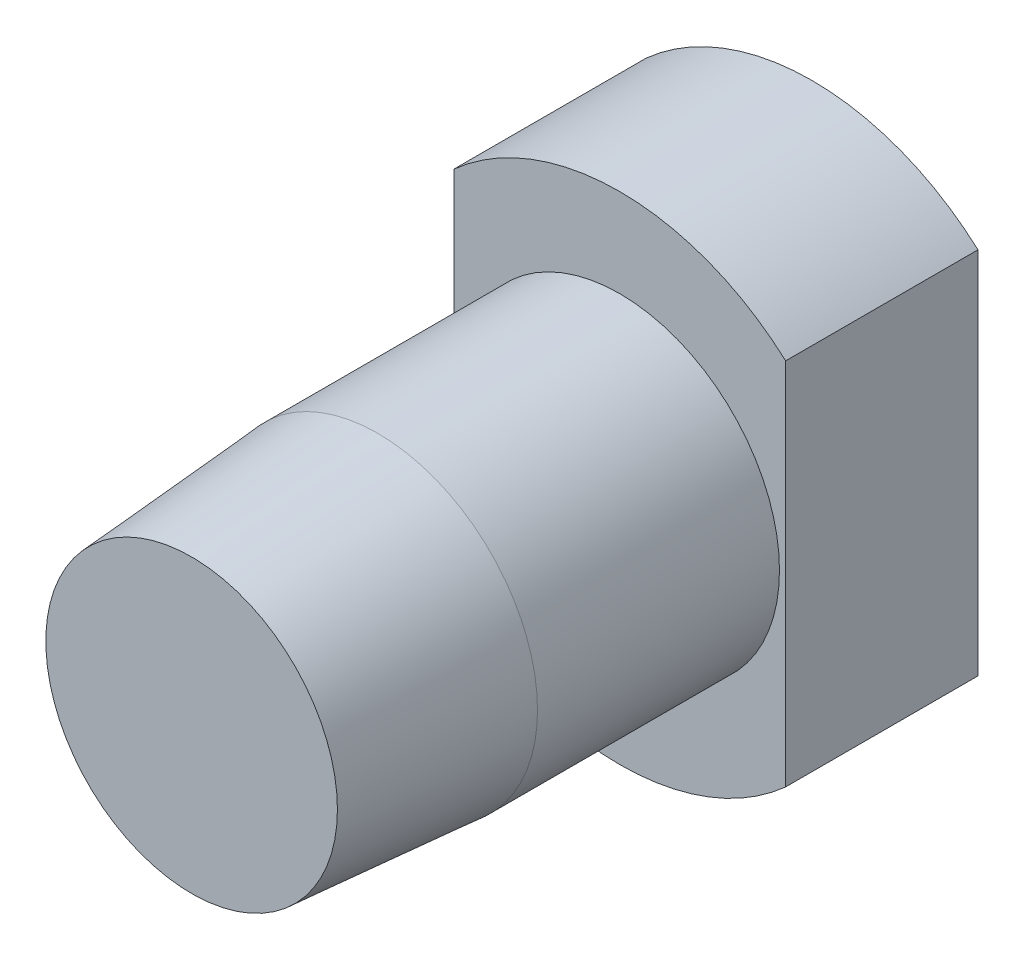
ISO-10303-21;
HEADER;
FILE_DESCRIPTION(('STEP AP214'),'2;1');
FILE_NAME('part.step','',(''),(''),'','','');
FILE_SCHEMA(('AUTOMOTIVE_DESIGN { 1 0 10303 214 1 1 1 1 }'));
ENDSEC;
DATA;
#1=APPLICATION_CONTEXT('core data for automotive mechanical design processes');
#2=APPLICATION_PROTOCOL_DEFINITION('international standard','automotive_design',2000,#1);
#3=PRODUCT_CONTEXT('',#1,'mechanical');
#4=PRODUCT('Part','Part','',(#3));
#5=PRODUCT_RELATED_PRODUCT_CATEGORY('part','',(#4));
#6=PRODUCT_DEFINITION_FORMATION('','',#4);
#7=PRODUCT_DEFINITION_CONTEXT('part definition',#1,'design');
#8=PRODUCT_DEFINITION('design','',#6,#7);
#9=PRODUCT_DEFINITION_SHAPE('','',#8);
#10=(LENGTH_UNIT() NAMED_UNIT(*) SI_UNIT(.MILLI.,.METRE.));
#11=(NAMED_UNIT(*) PLANE_ANGLE_UNIT() SI_UNIT($,.RADIAN.));
#12=(NAMED_UNIT(*) SI_UNIT($,.STERADIAN.) SOLID_ANGLE_UNIT());
#13=UNCERTAINTY_MEASURE_WITH_UNIT(LENGTH_MEASURE(1.E-05),#10,'distance_accuracy_value','');
#14=(GEOMETRIC_REPRESENTATION_CONTEXT(3) GLOBAL_UNCERTAINTY_ASSIGNED_CONTEXT((#13)) GLOBAL_UNIT_ASSIGNED_CONTEXT((#10,
#11,#12)) REPRESENTATION_CONTEXT('',''));
#15=CARTESIAN_POINT('',(0.,0.,0.));
#16=DIRECTION('',(0.,0.,1.));
#17=DIRECTION('',(1.,0.,0.));
#18=AXIS2_PLACEMENT_3D('',#15,#16,#17);
#19=CARTESIAN_POINT('',(0.,0.,0.));
#20=DIRECTION('',(0.,0.,1.));
#21=DIRECTION('',(1.,0.,0.));
#22=AXIS2_PLACEMENT_3D('',#19,#20,#21);
#23=CYLINDRICAL_SURFACE('',#22,4.);
#24=CARTESIAN_POINT('',(0.,0.,-10.));
#25=DIRECTION('',(0.,0.,1.));
#26=DIRECTION('',(1.,0.,0.));
#27=AXIS2_PLACEMENT_3D('',#24,#25,#26);
#28=CIRCLE('',#27,4.);
#29=CARTESIAN_POINT('',(-2.675,-2.97394939432398,-10.));
#30=VERTEX_POINT('',#29);
#31=CARTESIAN_POINT('',(2.675,-2.97394939432398,-10.));
#32=VERTEX_POINT('',#31);
#33=EDGE_CURVE('E97',#30,#32,#28,.T.);
#34=ORIENTED_EDGE('',*,*,#33,.T.);
#35=DIRECTION('',(0.,0.,1.));
#36=VECTOR('',#35,1.);
#37=CARTESIAN_POINT('',(2.675,-2.97394939432398,0.));
#38=LINE('',#37,#36);
#39=CARTESIAN_POINT('',(2.675,-2.97394939432398,-6.9));
#40=VERTEX_POINT('',#39);
#41=EDGE_CURVE('E56',#32,#40,#38,.T.);
#42=ORIENTED_EDGE('',*,*,#41,.T.);
#43=CARTESIAN_POINT('',(0.,0.,-6.9));
#44=DIRECTION('',(0.,0.,1.));
#45=DIRECTION('',(1.,0.,0.));
#46=AXIS2_PLACEMENT_3D('',#43,#44,#45);
#47=CIRCLE('',#46,4.);
#48=CARTESIAN_POINT('',(-2.675,-2.97394939432398,-6.9));
#49=VERTEX_POINT('',#48);
#50=EDGE_CURVE('E105',#49,#40,#47,.T.);
#51=ORIENTED_EDGE('',*,*,#50,.F.);
#52=DIRECTION('',(0.,0.,1.));
#53=VECTOR('',#52,1.);
#54=CARTESIAN_POINT('',(-2.675,-2.97394939432398,0.));
#55=LINE('',#54,#53);
#56=EDGE_CURVE('E140',#49,#30,#55,.F.);
#57=ORIENTED_EDGE('',*,*,#56,.T.);
#58=EDGE_LOOP('',(#34,#42,#51,#57));
#59=FACE_BOUND('',#58,.T.);
#60=ADVANCED_FACE('F41',(#59),#23,.T.);
#61=CARTESIAN_POINT('',(0.,0.,0.));
#62=DIRECTION('',(0.,0.,-1.));
#63=DIRECTION('',(-1.,0.,0.));
#64=AXIS2_PLACEMENT_3D('',#61,#62,#63);
#65=PLANE('',#64);
#66=CARTESIAN_POINT('',(0.,0.,0.));
#67=DIRECTION('',(0.,0.,1.));
#68=DIRECTION('',(1.,0.,0.));
#69=AXIS2_PLACEMENT_3D('',#66,#67,#68);
#70=CIRCLE('',#69,2.35);
#71=CARTESIAN_POINT('',(2.35,0.,0.));
#72=VERTEX_POINT('',#71);
#73=EDGE_CURVE('E114',#72,#72,#70,.T.);
#74=ORIENTED_EDGE('',*,*,#73,.T.);
#75=EDGE_LOOP('',(#74));
#76=FACE_BOUND('',#75,.T.);
#77=ADVANCED_FACE('F43',(#76),#65,.F.);
#78=CARTESIAN_POINT('',(0.,0.,-3.));
#79=DIRECTION('',(0.,0.,-1.));
#80=DIRECTION('',(-1.,0.,0.));
#81=AXIS2_PLACEMENT_3D('',#78,#79,#80);
#82=CONICAL_SURFACE('',#81,2.575,0.074859847710767);
#83=ORIENTED_EDGE('',*,*,#73,.F.);
#84=EDGE_LOOP('',(#83));
#85=FACE_BOUND('',#84,.T.);
#86=CARTESIAN_POINT('',(0.,0.,-3.));
#87=DIRECTION('',(0.,0.,1.));
#88=DIRECTION('',(1.,0.,0.));
#89=AXIS2_PLACEMENT_3D('',#86,#87,#88);
#90=CIRCLE('',#89,2.575);
#91=CARTESIAN_POINT('',(2.575,0.,-3.));
#92=VERTEX_POINT('',#91);
#93=EDGE_CURVE('E111',#92,#92,#90,.T.);
#94=ORIENTED_EDGE('',*,*,#93,.T.);
#95=EDGE_LOOP('',(#94));
#96=FACE_BOUND('',#95,.T.);
#97=ADVANCED_FACE('F119',(#85,#96),#82,.T.);
#98=CARTESIAN_POINT('',(0.,0.,0.));
#99=DIRECTION('',(0.,0.,1.));
#100=DIRECTION('',(1.,0.,0.));
#101=AXIS2_PLACEMENT_3D('',#98,#99,#100);
#102=CYLINDRICAL_SURFACE('',#101,2.575);
#103=ORIENTED_EDGE('',*,*,#93,.F.);
#104=EDGE_LOOP('',(#103));
#105=FACE_BOUND('',#104,.T.);
#106=CARTESIAN_POINT('',(0.,0.,-6.9));
#107=DIRECTION('',(0.,0.,1.));
#108=DIRECTION('',(1.,0.,0.));
#109=AXIS2_PLACEMENT_3D('',#106,#107,#108);
#110=CIRCLE('',#109,2.575);
#111=CARTESIAN_POINT('',(2.575,0.,-6.9));
#112=VERTEX_POINT('',#111);
#113=EDGE_CURVE('E108',#112,#112,#110,.T.);
#114=ORIENTED_EDGE('',*,*,#113,.T.);
#115=EDGE_LOOP('',(#114));
#116=FACE_BOUND('',#115,.T.);
#117=ADVANCED_FACE('F122',(#105,#116),#102,.T.);
#118=CARTESIAN_POINT('',(0.,2.575,-6.9));
#119=DIRECTION('',(0.,0.,-1.));
#120=DIRECTION('',(-1.,0.,0.));
#121=AXIS2_PLACEMENT_3D('',#118,#119,#120);
#122=PLANE('',#121);
#123=ORIENTED_EDGE('',*,*,#113,.F.);
#124=EDGE_LOOP('',(#123));
#125=FACE_BOUND('',#124,.T.);
#126=ORIENTED_EDGE('',*,*,#50,.T.);
#127=DIRECTION('',(0.,1.,0.));
#128=VECTOR('',#127,1.);
#129=CARTESIAN_POINT('',(2.675,2.575,-6.9));
#130=LINE('',#129,#128);
#131=CARTESIAN_POINT('',(2.675,2.97394939432398,-6.9));
#132=VERTEX_POINT('',#131);
#133=EDGE_CURVE('E92',#40,#132,#130,.T.);
#134=ORIENTED_EDGE('',*,*,#133,.T.);
#135=CARTESIAN_POINT('',(-2.675,2.97394939432398,-6.9));
#136=VERTEX_POINT('',#135);
#137=EDGE_CURVE('E91',#132,#136,#47,.T.);
#138=ORIENTED_EDGE('',*,*,#137,.T.);
#139=DIRECTION('',(0.,-1.,0.));
#140=VECTOR('',#139,1.);
#141=CARTESIAN_POINT('',(-2.675,2.575,-6.9));
#142=LINE('',#141,#140);
#143=EDGE_CURVE('E137',#136,#49,#142,.T.);
#144=ORIENTED_EDGE('',*,*,#143,.T.);
#145=EDGE_LOOP('',(#126,#134,#138,#144));
#146=FACE_BOUND('',#145,.T.);
#147=ADVANCED_FACE('F127',(#125,#146),#122,.F.);
#148=ORIENTED_EDGE('',*,*,#137,.F.);
#149=DIRECTION('',(0.,0.,1.));
#150=VECTOR('',#149,1.);
#151=CARTESIAN_POINT('',(2.675,2.97394939432398,0.));
#152=LINE('',#151,#150);
#153=CARTESIAN_POINT('',(2.675,2.97394939432398,-10.));
#154=VERTEX_POINT('',#153);
#155=EDGE_CURVE('E84',#132,#154,#152,.F.);
#156=ORIENTED_EDGE('',*,*,#155,.T.);
#157=CARTESIAN_POINT('',(-2.675,2.97394939432398,-10.));
#158=VERTEX_POINT('',#157);
#159=EDGE_CURVE('E63',#154,#158,#28,.T.);
#160=ORIENTED_EDGE('',*,*,#159,.T.);
#161=DIRECTION('',(0.,0.,1.));
#162=VECTOR('',#161,1.);
#163=CARTESIAN_POINT('',(-2.675,2.97394939432398,0.));
#164=LINE('',#163,#162);
#165=EDGE_CURVE('E101',#158,#136,#164,.T.);
#166=ORIENTED_EDGE('',*,*,#165,.T.);
#167=EDGE_LOOP('',(#148,#156,#160,#166));
#168=FACE_BOUND('',#167,.T.);
#169=ADVANCED_FACE('F90',(#168),#23,.T.);
#170=CARTESIAN_POINT('',(0.,4.,-10.));
#171=DIRECTION('',(0.,0.,1.));
#172=DIRECTION('',(1.,0.,0.));
#173=AXIS2_PLACEMENT_3D('',#170,#171,#172);
#174=PLANE('',#173);
#175=ORIENTED_EDGE('',*,*,#159,.F.);
#176=DIRECTION('',(0.,-1.,0.));
#177=VECTOR('',#176,1.);
#178=CARTESIAN_POINT('',(2.675,4.,-10.));
#179=LINE('',#178,#177);
#180=EDGE_CURVE('E11',#154,#32,#179,.T.);
#181=ORIENTED_EDGE('',*,*,#180,.T.);
#182=ORIENTED_EDGE('',*,*,#33,.F.);
#183=DIRECTION('',(0.,1.,0.));
#184=VECTOR('',#183,1.);
#185=CARTESIAN_POINT('',(-2.675,4.,-10.));
#186=LINE('',#185,#184);
#187=EDGE_CURVE('E49',#30,#158,#186,.T.);
#188=ORIENTED_EDGE('',*,*,#187,.T.);
#189=EDGE_LOOP('',(#175,#181,#182,#188));
#190=FACE_BOUND('',#189,.T.);
#191=CARTESIAN_POINT('',(0.,0.,-10.));
#192=DIRECTION('',(0.,0.,1.));
#193=DIRECTION('',(1.,0.,0.));
#194=AXIS2_PLACEMENT_3D('',#191,#192,#193);
#195=CIRCLE('',#194,2.25);
#196=CARTESIAN_POINT('',(2.25,0.,-10.));
#197=VERTEX_POINT('',#196);
#198=EDGE_CURVE('E98',#197,#197,#195,.T.);
#199=ORIENTED_EDGE('',*,*,#198,.T.);
#200=EDGE_LOOP('',(#199));
#201=FACE_BOUND('',#200,.T.);
#202=ADVANCED_FACE('F95',(#190,#201),#174,.F.);
#203=CARTESIAN_POINT('',(0.,0.,-7.74999999999998));
#204=DIRECTION('',(0.,0.,-1.));
#205=DIRECTION('',(-1.,0.,0.));
#206=AXIS2_PLACEMENT_3D('',#203,#204,#205);
#207=CONICAL_SURFACE('',#206,0.,0.785398163397443);
#208=ORIENTED_EDGE('',*,*,#198,.F.);
#209=EDGE_LOOP('',(#208));
#210=FACE_BOUND('',#209,.T.);
#211=CARTESIAN_POINT('',(0.,0.,-7.74999999999998));
#212=VERTEX_POINT('',#211);
#213=VERTEX_LOOP('',#212);
#214=FACE_BOUND('',#213,.T.);
#215=ADVANCED_FACE('F148',(#210,#214),#207,.F.);
#216=CARTESIAN_POINT('',(-2.675,4.21619831491807,0.));
#217=DIRECTION('',(1.,0.,0.));
#218=DIRECTION('',(0.,0.,-1.));
#219=AXIS2_PLACEMENT_3D('',#216,#217,#218);
#220=PLANE('',#219);
#221=ORIENTED_EDGE('',*,*,#187,.F.);
#222=ORIENTED_EDGE('',*,*,#56,.F.);
#223=ORIENTED_EDGE('',*,*,#143,.F.);
#224=ORIENTED_EDGE('',*,*,#165,.F.);
#225=EDGE_LOOP('',(#221,#222,#223,#224));
#226=FACE_BOUND('',#225,.T.);
#227=ADVANCED_FACE('F146',(#226),#220,.F.);
#228=CARTESIAN_POINT('',(2.675,4.21619831491807,0.));
#229=DIRECTION('',(-1.,0.,0.));
#230=DIRECTION('',(0.,0.,1.));
#231=AXIS2_PLACEMENT_3D('',#228,#229,#230);
#232=PLANE('',#231);
#233=ORIENTED_EDGE('',*,*,#180,.F.);
#234=ORIENTED_EDGE('',*,*,#155,.F.);
#235=ORIENTED_EDGE('',*,*,#133,.F.);
#236=ORIENTED_EDGE('',*,*,#41,.F.);
#237=EDGE_LOOP('',(#233,#234,#235,#236));
#238=FACE_BOUND('',#237,.T.);
#239=ADVANCED_FACE('F83',(#238),#232,.F.);
#240=CLOSED_SHELL('',(#60,#77,#97,#117,#147,#169,#202,#215,#227,#239));
#241=MANIFOLD_SOLID_BREP('B2',#240);
#242=ADVANCED_BREP_SHAPE_REPRESENTATION('',(#18,#241),#14);
#243=SHAPE_DEFINITION_REPRESENTATION(#9,#242);
ENDSEC;
END-ISO-10303-21;
